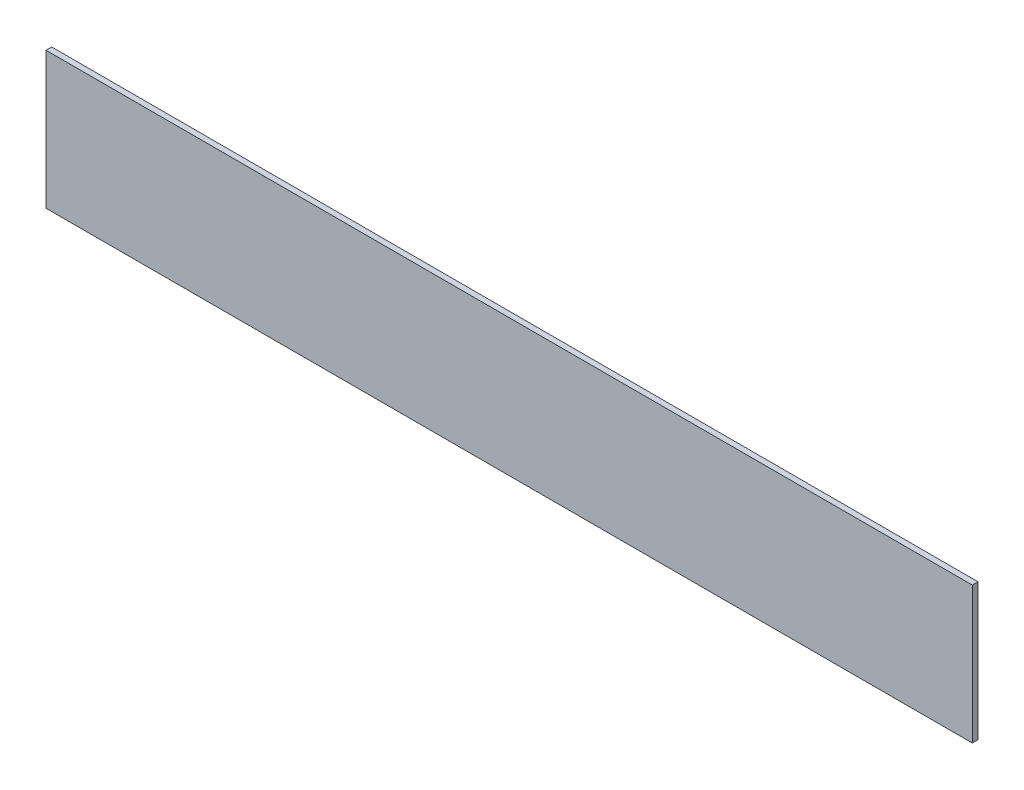
ISO-10303-21;
HEADER;
FILE_DESCRIPTION(('STEP AP214'),'2;1');
FILE_NAME('part.step','',(''),(''),'','','');
FILE_SCHEMA(('AUTOMOTIVE_DESIGN { 1 0 10303 214 1 1 1 1 }'));
ENDSEC;
DATA;
#1=APPLICATION_CONTEXT('core data for automotive mechanical design processes');
#2=APPLICATION_PROTOCOL_DEFINITION('international standard','automotive_design',2000,#1);
#3=PRODUCT_CONTEXT('',#1,'mechanical');
#4=PRODUCT('Part','Part','',(#3));
#5=PRODUCT_RELATED_PRODUCT_CATEGORY('part','',(#4));
#6=PRODUCT_DEFINITION_FORMATION('','',#4);
#7=PRODUCT_DEFINITION_CONTEXT('part definition',#1,'design');
#8=PRODUCT_DEFINITION('design','',#6,#7);
#9=PRODUCT_DEFINITION_SHAPE('','',#8);
#10=(LENGTH_UNIT() NAMED_UNIT(*) SI_UNIT(.MILLI.,.METRE.));
#11=(NAMED_UNIT(*) PLANE_ANGLE_UNIT() SI_UNIT($,.RADIAN.));
#12=(NAMED_UNIT(*) SI_UNIT($,.STERADIAN.) SOLID_ANGLE_UNIT());
#13=UNCERTAINTY_MEASURE_WITH_UNIT(LENGTH_MEASURE(1.E-05),#10,'distance_accuracy_value','');
#14=(GEOMETRIC_REPRESENTATION_CONTEXT(3) GLOBAL_UNCERTAINTY_ASSIGNED_CONTEXT((#13)) GLOBAL_UNIT_ASSIGNED_CONTEXT((#10,
#11,#12)) REPRESENTATION_CONTEXT('',''));
#15=CARTESIAN_POINT('',(0.,0.,0.));
#16=DIRECTION('',(0.,0.,1.));
#17=DIRECTION('',(1.,0.,0.));
#18=AXIS2_PLACEMENT_3D('',#15,#16,#17);
#19=CARTESIAN_POINT('',(515.874,76.2,6.35));
#20=DIRECTION('',(-1.,0.,0.));
#21=DIRECTION('',(0.,0.,1.));
#22=AXIS2_PLACEMENT_3D('',#19,#20,#21);
#23=PLANE('',#22);
#24=DIRECTION('',(0.,1.,0.));
#25=VECTOR('',#24,1.);
#26=CARTESIAN_POINT('',(515.874,76.2,0.));
#27=LINE('',#26,#25);
#28=CARTESIAN_POINT('',(515.874,-76.2,0.));
#29=VERTEX_POINT('',#28);
#30=CARTESIAN_POINT('',(515.874,76.2,0.));
#31=VERTEX_POINT('',#30);
#32=EDGE_CURVE('E96',#29,#31,#27,.T.);
#33=ORIENTED_EDGE('',*,*,#32,.T.);
#34=DIRECTION('',(0.,0.,-1.));
#35=VECTOR('',#34,1.);
#36=CARTESIAN_POINT('',(515.874,76.2,6.35));
#37=LINE('',#36,#35);
#38=CARTESIAN_POINT('',(515.874,76.2,6.35));
#39=VERTEX_POINT('',#38);
#40=EDGE_CURVE('E11',#39,#31,#37,.T.);
#41=ORIENTED_EDGE('',*,*,#40,.F.);
#42=DIRECTION('',(0.,1.,0.));
#43=VECTOR('',#42,1.);
#44=CARTESIAN_POINT('',(515.874,76.2,6.35));
#45=LINE('',#44,#43);
#46=CARTESIAN_POINT('',(515.874,-76.2,6.35));
#47=VERTEX_POINT('',#46);
#48=EDGE_CURVE('E84',#47,#39,#45,.T.);
#49=ORIENTED_EDGE('',*,*,#48,.F.);
#50=DIRECTION('',(0.,0.,-1.));
#51=VECTOR('',#50,1.);
#52=CARTESIAN_POINT('',(515.874,-76.2,6.35));
#53=LINE('',#52,#51);
#54=EDGE_CURVE('E92',#47,#29,#53,.T.);
#55=ORIENTED_EDGE('',*,*,#54,.T.);
#56=EDGE_LOOP('',(#33,#41,#49,#55));
#57=FACE_BOUND('',#56,.T.);
#58=ADVANCED_FACE('F33',(#57),#23,.F.);
#59=CARTESIAN_POINT('',(-515.874,76.2,6.35));
#60=DIRECTION('',(0.,-1.,0.));
#61=DIRECTION('',(0.,0.,-1.));
#62=AXIS2_PLACEMENT_3D('',#59,#60,#61);
#63=PLANE('',#62);
#64=DIRECTION('',(-1.,0.,0.));
#65=VECTOR('',#64,1.);
#66=CARTESIAN_POINT('',(-515.874,76.2,0.));
#67=LINE('',#66,#65);
#68=CARTESIAN_POINT('',(-515.874,76.2,0.));
#69=VERTEX_POINT('',#68);
#70=EDGE_CURVE('E88',#31,#69,#67,.T.);
#71=ORIENTED_EDGE('',*,*,#70,.T.);
#72=DIRECTION('',(0.,0.,-1.));
#73=VECTOR('',#72,1.);
#74=CARTESIAN_POINT('',(-515.874,76.2,6.35));
#75=LINE('',#74,#73);
#76=CARTESIAN_POINT('',(-515.874,76.2,6.35));
#77=VERTEX_POINT('',#76);
#78=EDGE_CURVE('E41',#77,#69,#75,.T.);
#79=ORIENTED_EDGE('',*,*,#78,.F.);
#80=DIRECTION('',(-1.,0.,0.));
#81=VECTOR('',#80,1.);
#82=CARTESIAN_POINT('',(-515.874,76.2,6.35));
#83=LINE('',#82,#81);
#84=EDGE_CURVE('E79',#39,#77,#83,.T.);
#85=ORIENTED_EDGE('',*,*,#84,.F.);
#86=ORIENTED_EDGE('',*,*,#40,.T.);
#87=EDGE_LOOP('',(#71,#79,#85,#86));
#88=FACE_BOUND('',#87,.T.);
#89=ADVANCED_FACE('F87',(#88),#63,.F.);
#90=CARTESIAN_POINT('',(-515.874,76.2,6.35));
#91=DIRECTION('',(1.,0.,0.));
#92=DIRECTION('',(0.,0.,-1.));
#93=AXIS2_PLACEMENT_3D('',#90,#91,#92);
#94=PLANE('',#93);
#95=DIRECTION('',(0.,-1.,0.));
#96=VECTOR('',#95,1.);
#97=CARTESIAN_POINT('',(-515.874,76.2,0.));
#98=LINE('',#97,#96);
#99=CARTESIAN_POINT('',(-515.874,-76.2,0.));
#100=VERTEX_POINT('',#99);
#101=EDGE_CURVE('E66',#69,#100,#98,.T.);
#102=ORIENTED_EDGE('',*,*,#101,.T.);
#103=DIRECTION('',(0.,0.,-1.));
#104=VECTOR('',#103,1.);
#105=CARTESIAN_POINT('',(-515.874,-76.2,6.35));
#106=LINE('',#105,#104);
#107=CARTESIAN_POINT('',(-515.874,-76.2,6.35));
#108=VERTEX_POINT('',#107);
#109=EDGE_CURVE('E89',#108,#100,#106,.T.);
#110=ORIENTED_EDGE('',*,*,#109,.F.);
#111=DIRECTION('',(0.,-1.,0.));
#112=VECTOR('',#111,1.);
#113=CARTESIAN_POINT('',(-515.874,76.2,6.35));
#114=LINE('',#113,#112);
#115=EDGE_CURVE('E82',#77,#108,#114,.T.);
#116=ORIENTED_EDGE('',*,*,#115,.F.);
#117=ORIENTED_EDGE('',*,*,#78,.T.);
#118=EDGE_LOOP('',(#102,#110,#116,#117));
#119=FACE_BOUND('',#118,.T.);
#120=ADVANCED_FACE('F90',(#119),#94,.F.);
#121=CARTESIAN_POINT('',(-515.874,-76.2,6.35));
#122=DIRECTION('',(0.,1.,0.));
#123=DIRECTION('',(0.,0.,1.));
#124=AXIS2_PLACEMENT_3D('',#121,#122,#123);
#125=PLANE('',#124);
#126=DIRECTION('',(1.,0.,0.));
#127=VECTOR('',#126,1.);
#128=CARTESIAN_POINT('',(-515.874,-76.2,0.));
#129=LINE('',#128,#127);
#130=EDGE_CURVE('E72',#100,#29,#129,.T.);
#131=ORIENTED_EDGE('',*,*,#130,.T.);
#132=ORIENTED_EDGE('',*,*,#54,.F.);
#133=DIRECTION('',(1.,0.,0.));
#134=VECTOR('',#133,1.);
#135=CARTESIAN_POINT('',(-515.874,-76.2,6.35));
#136=LINE('',#135,#134);
#137=EDGE_CURVE('E49',#108,#47,#136,.T.);
#138=ORIENTED_EDGE('',*,*,#137,.F.);
#139=ORIENTED_EDGE('',*,*,#109,.T.);
#140=EDGE_LOOP('',(#131,#132,#138,#139));
#141=FACE_BOUND('',#140,.T.);
#142=ADVANCED_FACE('F103',(#141),#125,.F.);
#143=CARTESIAN_POINT('',(0.,0.,6.35));
#144=DIRECTION('',(0.,0.,1.));
#145=DIRECTION('',(1.,0.,0.));
#146=AXIS2_PLACEMENT_3D('',#143,#144,#145);
#147=PLANE('',#146);
#148=ORIENTED_EDGE('',*,*,#48,.T.);
#149=ORIENTED_EDGE('',*,*,#84,.T.);
#150=ORIENTED_EDGE('',*,*,#115,.T.);
#151=ORIENTED_EDGE('',*,*,#137,.T.);
#152=EDGE_LOOP('',(#148,#149,#150,#151));
#153=FACE_BOUND('',#152,.T.);
#154=ADVANCED_FACE('F80',(#153),#147,.T.);
#155=CARTESIAN_POINT('',(0.,0.,0.));
#156=DIRECTION('',(0.,0.,1.));
#157=DIRECTION('',(1.,0.,0.));
#158=AXIS2_PLACEMENT_3D('',#155,#156,#157);
#159=PLANE('',#158);
#160=ORIENTED_EDGE('',*,*,#32,.F.);
#161=ORIENTED_EDGE('',*,*,#130,.F.);
#162=ORIENTED_EDGE('',*,*,#101,.F.);
#163=ORIENTED_EDGE('',*,*,#70,.F.);
#164=EDGE_LOOP('',(#160,#161,#162,#163));
#165=FACE_BOUND('',#164,.T.);
#166=ADVANCED_FACE('F106',(#165),#159,.F.);
#167=CLOSED_SHELL('',(#58,#89,#120,#142,#154,#166));
#168=MANIFOLD_SOLID_BREP('B2',#167);
#169=ADVANCED_BREP_SHAPE_REPRESENTATION('',(#18,#168),#14);
#170=SHAPE_DEFINITION_REPRESENTATION(#9,#169);
ENDSEC;
END-ISO-10303-21;
